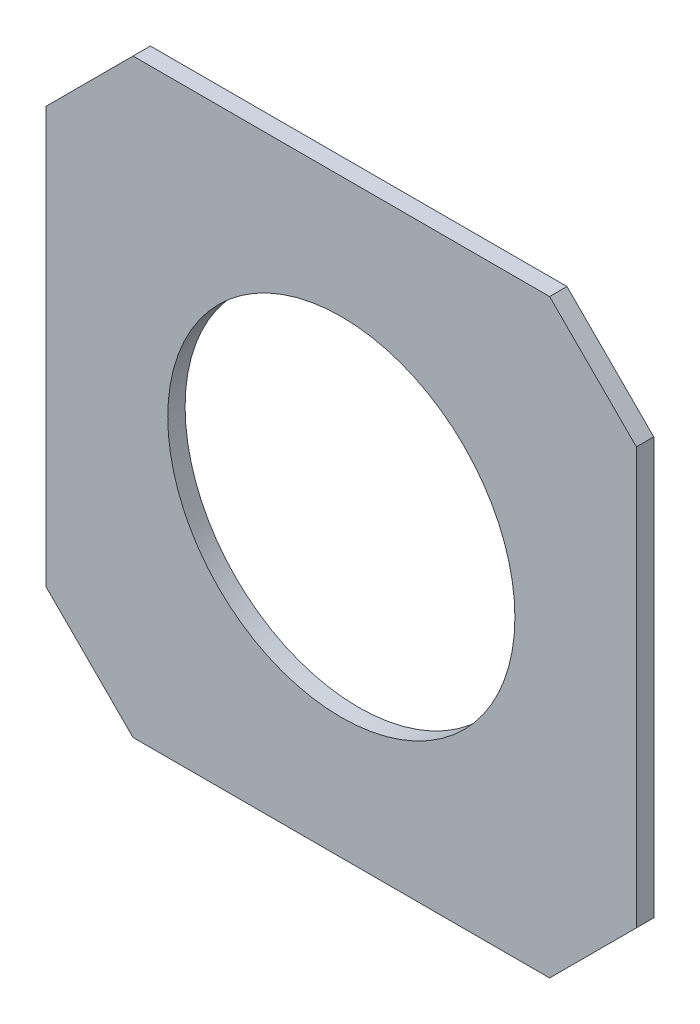
ISO-10303-21;
HEADER;
FILE_DESCRIPTION(('STEP AP214'),'2;1');
FILE_NAME('part.step','',(''),(''),'','','');
FILE_SCHEMA(('AUTOMOTIVE_DESIGN { 1 0 10303 214 1 1 1 1 }'));
ENDSEC;
DATA;
#1=APPLICATION_CONTEXT('core data for automotive mechanical design processes');
#2=APPLICATION_PROTOCOL_DEFINITION('international standard','automotive_design',2000,#1);
#3=PRODUCT_CONTEXT('',#1,'mechanical');
#4=PRODUCT('Part','Part','',(#3));
#5=PRODUCT_RELATED_PRODUCT_CATEGORY('part','',(#4));
#6=PRODUCT_DEFINITION_FORMATION('','',#4);
#7=PRODUCT_DEFINITION_CONTEXT('part definition',#1,'design');
#8=PRODUCT_DEFINITION('design','',#6,#7);
#9=PRODUCT_DEFINITION_SHAPE('','',#8);
#10=(LENGTH_UNIT() NAMED_UNIT(*) SI_UNIT(.MILLI.,.METRE.));
#11=(NAMED_UNIT(*) PLANE_ANGLE_UNIT() SI_UNIT($,.RADIAN.));
#12=(NAMED_UNIT(*) SI_UNIT($,.STERADIAN.) SOLID_ANGLE_UNIT());
#13=UNCERTAINTY_MEASURE_WITH_UNIT(LENGTH_MEASURE(1.E-05),#10,'distance_accuracy_value','');
#14=(GEOMETRIC_REPRESENTATION_CONTEXT(3) GLOBAL_UNCERTAINTY_ASSIGNED_CONTEXT((#13)) GLOBAL_UNIT_ASSIGNED_CONTEXT((#10,
#11,#12)) REPRESENTATION_CONTEXT('',''));
#15=CARTESIAN_POINT('',(0.,0.,0.));
#16=DIRECTION('',(0.,0.,1.));
#17=DIRECTION('',(1.,0.,0.));
#18=AXIS2_PLACEMENT_3D('',#15,#16,#17);
#19=CARTESIAN_POINT('',(17.,0.,0.5));
#20=DIRECTION('',(-1.,0.,0.));
#21=DIRECTION('',(0.,-1.,0.));
#22=AXIS2_PLACEMENT_3D('',#19,#20,#21);
#23=PLANE('',#22);
#24=DIRECTION('',(0.,0.,1.));
#25=VECTOR('',#24,1.);
#26=CARTESIAN_POINT('',(17.,-14.5,0.));
#27=LINE('',#26,#25);
#28=CARTESIAN_POINT('',(17.,-14.5,0.));
#29=VERTEX_POINT('',#28);
#30=CARTESIAN_POINT('',(17.,-14.5,0.5));
#31=VERTEX_POINT('',#30);
#32=EDGE_CURVE('E143',#29,#31,#27,.T.);
#33=ORIENTED_EDGE('',*,*,#32,.F.);
#34=DIRECTION('',(0.,1.,0.));
#35=VECTOR('',#34,1.);
#36=CARTESIAN_POINT('',(17.,0.,0.));
#37=LINE('',#36,#35);
#38=CARTESIAN_POINT('',(17.,-2.5,0.));
#39=VERTEX_POINT('',#38);
#40=EDGE_CURVE('E123',#29,#39,#37,.T.);
#41=ORIENTED_EDGE('',*,*,#40,.T.);
#42=DIRECTION('',(0.,0.,1.));
#43=VECTOR('',#42,1.);
#44=CARTESIAN_POINT('',(17.,-2.5,0.));
#45=LINE('',#44,#43);
#46=CARTESIAN_POINT('',(17.,-2.5,0.5));
#47=VERTEX_POINT('',#46);
#48=EDGE_CURVE('E104',#39,#47,#45,.T.);
#49=ORIENTED_EDGE('',*,*,#48,.T.);
#50=DIRECTION('',(0.,1.,0.));
#51=VECTOR('',#50,1.);
#52=CARTESIAN_POINT('',(17.,0.,0.5));
#53=LINE('',#52,#51);
#54=EDGE_CURVE('E132',#31,#47,#53,.T.);
#55=ORIENTED_EDGE('',*,*,#54,.F.);
#56=EDGE_LOOP('',(#33,#41,#49,#55));
#57=FACE_BOUND('',#56,.T.);
#58=ADVANCED_FACE('F33',(#57),#23,.F.);
#59=CARTESIAN_POINT('',(0.,0.,0.5));
#60=DIRECTION('',(0.,-1.,0.));
#61=DIRECTION('',(0.,0.,-1.));
#62=AXIS2_PLACEMENT_3D('',#59,#60,#61);
#63=PLANE('',#62);
#64=DIRECTION('',(0.,0.,1.));
#65=VECTOR('',#64,1.);
#66=CARTESIAN_POINT('',(2.5,0.,0.));
#67=LINE('',#66,#65);
#68=CARTESIAN_POINT('',(2.5,0.,0.));
#69=VERTEX_POINT('',#68);
#70=CARTESIAN_POINT('',(2.5,0.,0.5));
#71=VERTEX_POINT('',#70);
#72=EDGE_CURVE('E49',#69,#71,#67,.T.);
#73=ORIENTED_EDGE('',*,*,#72,.T.);
#74=DIRECTION('',(-1.,0.,0.));
#75=VECTOR('',#74,1.);
#76=CARTESIAN_POINT('',(0.,0.,0.5));
#77=LINE('',#76,#75);
#78=CARTESIAN_POINT('',(14.5,0.,0.5));
#79=VERTEX_POINT('',#78);
#80=EDGE_CURVE('E117',#79,#71,#77,.T.);
#81=ORIENTED_EDGE('',*,*,#80,.F.);
#82=DIRECTION('',(0.,0.,1.));
#83=VECTOR('',#82,1.);
#84=CARTESIAN_POINT('',(14.5,0.,0.));
#85=LINE('',#84,#83);
#86=CARTESIAN_POINT('',(14.5,0.,0.));
#87=VERTEX_POINT('',#86);
#88=EDGE_CURVE('E101',#87,#79,#85,.T.);
#89=ORIENTED_EDGE('',*,*,#88,.F.);
#90=DIRECTION('',(-1.,0.,0.));
#91=VECTOR('',#90,1.);
#92=CARTESIAN_POINT('',(0.,0.,0.));
#93=LINE('',#92,#91);
#94=EDGE_CURVE('E115',#87,#69,#93,.T.);
#95=ORIENTED_EDGE('',*,*,#94,.T.);
#96=EDGE_LOOP('',(#73,#81,#89,#95));
#97=FACE_BOUND('',#96,.T.);
#98=ADVANCED_FACE('F114',(#97),#63,.F.);
#99=CARTESIAN_POINT('',(0.,-17.,0.5));
#100=DIRECTION('',(1.,0.,0.));
#101=DIRECTION('',(0.,0.,-1.));
#102=AXIS2_PLACEMENT_3D('',#99,#100,#101);
#103=PLANE('',#102);
#104=DIRECTION('',(0.,-1.,0.));
#105=VECTOR('',#104,1.);
#106=CARTESIAN_POINT('',(0.,-17.,0.));
#107=LINE('',#106,#105);
#108=CARTESIAN_POINT('',(0.,-2.5,0.));
#109=VERTEX_POINT('',#108);
#110=CARTESIAN_POINT('',(0.,-14.5,0.));
#111=VERTEX_POINT('',#110);
#112=EDGE_CURVE('E122',#109,#111,#107,.T.);
#113=ORIENTED_EDGE('',*,*,#112,.T.);
#114=DIRECTION('',(0.,0.,1.));
#115=VECTOR('',#114,1.);
#116=CARTESIAN_POINT('',(0.,-14.5,0.));
#117=LINE('',#116,#115);
#118=CARTESIAN_POINT('',(0.,-14.5,0.5));
#119=VERTEX_POINT('',#118);
#120=EDGE_CURVE('E57',#111,#119,#117,.T.);
#121=ORIENTED_EDGE('',*,*,#120,.T.);
#122=DIRECTION('',(0.,-1.,0.));
#123=VECTOR('',#122,1.);
#124=CARTESIAN_POINT('',(0.,-17.,0.5));
#125=LINE('',#124,#123);
#126=CARTESIAN_POINT('',(0.,-2.5,0.5));
#127=VERTEX_POINT('',#126);
#128=EDGE_CURVE('E41',#127,#119,#125,.T.);
#129=ORIENTED_EDGE('',*,*,#128,.F.);
#130=DIRECTION('',(0.,0.,1.));
#131=VECTOR('',#130,1.);
#132=CARTESIAN_POINT('',(0.,-2.5,0.));
#133=LINE('',#132,#131);
#134=EDGE_CURVE('E159',#109,#127,#133,.T.);
#135=ORIENTED_EDGE('',*,*,#134,.F.);
#136=EDGE_LOOP('',(#113,#121,#129,#135));
#137=FACE_BOUND('',#136,.T.);
#138=ADVANCED_FACE('F182',(#137),#103,.F.);
#139=CARTESIAN_POINT('',(17.,-17.,0.5));
#140=DIRECTION('',(0.,1.,0.));
#141=DIRECTION('',(-1.,0.,0.));
#142=AXIS2_PLACEMENT_3D('',#139,#140,#141);
#143=PLANE('',#142);
#144=DIRECTION('',(0.,0.,1.));
#145=VECTOR('',#144,1.);
#146=CARTESIAN_POINT('',(14.5,-17.,0.));
#147=LINE('',#146,#145);
#148=CARTESIAN_POINT('',(14.5,-17.,0.));
#149=VERTEX_POINT('',#148);
#150=CARTESIAN_POINT('',(14.5,-17.,0.5));
#151=VERTEX_POINT('',#150);
#152=EDGE_CURVE('E140',#149,#151,#147,.T.);
#153=ORIENTED_EDGE('',*,*,#152,.T.);
#154=DIRECTION('',(1.,0.,0.));
#155=VECTOR('',#154,1.);
#156=CARTESIAN_POINT('',(17.,-17.,0.5));
#157=LINE('',#156,#155);
#158=CARTESIAN_POINT('',(2.5,-17.,0.5));
#159=VERTEX_POINT('',#158);
#160=EDGE_CURVE('E11',#159,#151,#157,.T.);
#161=ORIENTED_EDGE('',*,*,#160,.F.);
#162=DIRECTION('',(0.,0.,1.));
#163=VECTOR('',#162,1.);
#164=CARTESIAN_POINT('',(2.5,-17.,0.));
#165=LINE('',#164,#163);
#166=CARTESIAN_POINT('',(2.5,-17.,0.));
#167=VERTEX_POINT('',#166);
#168=EDGE_CURVE('E151',#167,#159,#165,.T.);
#169=ORIENTED_EDGE('',*,*,#168,.F.);
#170=DIRECTION('',(1.,0.,0.));
#171=VECTOR('',#170,1.);
#172=CARTESIAN_POINT('',(17.,-17.,0.));
#173=LINE('',#172,#171);
#174=EDGE_CURVE('E36',#167,#149,#173,.T.);
#175=ORIENTED_EDGE('',*,*,#174,.T.);
#176=EDGE_LOOP('',(#153,#161,#169,#175));
#177=FACE_BOUND('',#176,.T.);
#178=ADVANCED_FACE('F177',(#177),#143,.F.);
#179=CARTESIAN_POINT('',(0.,0.,0.5));
#180=DIRECTION('',(0.,0.,-1.));
#181=DIRECTION('',(-1.,0.,0.));
#182=AXIS2_PLACEMENT_3D('',#179,#180,#181);
#183=PLANE('',#182);
#184=CARTESIAN_POINT('',(8.5,-8.5,0.5));
#185=DIRECTION('',(0.,0.,1.));
#186=DIRECTION('',(1.,0.,0.));
#187=AXIS2_PLACEMENT_3D('',#184,#185,#186);
#188=CIRCLE('',#187,5.);
#189=CARTESIAN_POINT('',(13.5,-8.5,0.5));
#190=VERTEX_POINT('',#189);
#191=EDGE_CURVE('E135',#190,#190,#188,.T.);
#192=ORIENTED_EDGE('',*,*,#191,.F.);
#193=EDGE_LOOP('',(#192));
#194=FACE_BOUND('',#193,.T.);
#195=DIRECTION('',(0.707106781186547,0.707106781186549,0.));
#196=VECTOR('',#195,1.);
#197=CARTESIAN_POINT('',(15.75,-15.75,0.5));
#198=LINE('',#197,#196);
#199=EDGE_CURVE('E147',#151,#31,#198,.T.);
#200=ORIENTED_EDGE('',*,*,#199,.T.);
#201=ORIENTED_EDGE('',*,*,#54,.T.);
#202=DIRECTION('',(0.707106781186547,-0.707106781186548,0.));
#203=VECTOR('',#202,1.);
#204=CARTESIAN_POINT('',(7.25,7.25,0.5));
#205=LINE('',#204,#203);
#206=EDGE_CURVE('E109',#79,#47,#205,.T.);
#207=ORIENTED_EDGE('',*,*,#206,.F.);
#208=ORIENTED_EDGE('',*,*,#80,.T.);
#209=DIRECTION('',(-0.707106781186548,-0.707106781186548,0.));
#210=VECTOR('',#209,1.);
#211=CARTESIAN_POINT('',(1.25,-1.25,0.5));
#212=LINE('',#211,#210);
#213=EDGE_CURVE('E155',#71,#127,#212,.T.);
#214=ORIENTED_EDGE('',*,*,#213,.T.);
#215=ORIENTED_EDGE('',*,*,#128,.T.);
#216=DIRECTION('',(-0.707106781186548,0.707106781186548,0.));
#217=VECTOR('',#216,1.);
#218=CARTESIAN_POINT('',(-7.25,-7.25,0.5));
#219=LINE('',#218,#217);
#220=EDGE_CURVE('E146',#159,#119,#219,.T.);
#221=ORIENTED_EDGE('',*,*,#220,.F.);
#222=ORIENTED_EDGE('',*,*,#160,.T.);
#223=EDGE_LOOP('',(#200,#201,#207,#208,#214,#215,#221,#222));
#224=FACE_BOUND('',#223,.T.);
#225=ADVANCED_FACE('F169',(#194,#224),#183,.F.);
#226=CARTESIAN_POINT('',(0.,0.,0.));
#227=DIRECTION('',(0.,0.,-1.));
#228=DIRECTION('',(-1.,0.,0.));
#229=AXIS2_PLACEMENT_3D('',#226,#227,#228);
#230=PLANE('',#229);
#231=CARTESIAN_POINT('',(8.5,-8.5,0.));
#232=DIRECTION('',(0.,0.,1.));
#233=DIRECTION('',(1.,0.,0.));
#234=AXIS2_PLACEMENT_3D('',#231,#232,#233);
#235=CIRCLE('',#234,5.);
#236=CARTESIAN_POINT('',(13.5,-8.5,0.));
#237=VERTEX_POINT('',#236);
#238=EDGE_CURVE('E126',#237,#237,#235,.T.);
#239=ORIENTED_EDGE('',*,*,#238,.T.);
#240=EDGE_LOOP('',(#239));
#241=FACE_BOUND('',#240,.T.);
#242=ORIENTED_EDGE('',*,*,#40,.F.);
#243=DIRECTION('',(0.707106781186547,0.707106781186549,0.));
#244=VECTOR('',#243,1.);
#245=CARTESIAN_POINT('',(15.75,-15.75,0.));
#246=LINE('',#245,#244);
#247=EDGE_CURVE('E144',#149,#29,#246,.T.);
#248=ORIENTED_EDGE('',*,*,#247,.F.);
#249=ORIENTED_EDGE('',*,*,#174,.F.);
#250=DIRECTION('',(-0.707106781186548,0.707106781186548,0.));
#251=VECTOR('',#250,1.);
#252=CARTESIAN_POINT('',(-7.25,-7.25,0.));
#253=LINE('',#252,#251);
#254=EDGE_CURVE('E153',#167,#111,#253,.T.);
#255=ORIENTED_EDGE('',*,*,#254,.T.);
#256=ORIENTED_EDGE('',*,*,#112,.F.);
#257=DIRECTION('',(-0.707106781186548,-0.707106781186548,0.));
#258=VECTOR('',#257,1.);
#259=CARTESIAN_POINT('',(1.25,-1.25,0.));
#260=LINE('',#259,#258);
#261=EDGE_CURVE('E121',#69,#109,#260,.T.);
#262=ORIENTED_EDGE('',*,*,#261,.F.);
#263=ORIENTED_EDGE('',*,*,#94,.F.);
#264=DIRECTION('',(0.707106781186547,-0.707106781186548,0.));
#265=VECTOR('',#264,1.);
#266=CARTESIAN_POINT('',(7.25,7.25,0.));
#267=LINE('',#266,#265);
#268=EDGE_CURVE('E98',#87,#39,#267,.T.);
#269=ORIENTED_EDGE('',*,*,#268,.T.);
#270=EDGE_LOOP('',(#242,#248,#249,#255,#256,#262,#263,#269));
#271=FACE_BOUND('',#270,.T.);
#272=ADVANCED_FACE('F119',(#241,#271),#230,.T.);
#273=CARTESIAN_POINT('',(8.5,-8.5,0.));
#274=DIRECTION('',(0.,0.,1.));
#275=DIRECTION('',(1.,0.,0.));
#276=AXIS2_PLACEMENT_3D('',#273,#274,#275);
#277=CYLINDRICAL_SURFACE('',#276,5.);
#278=ORIENTED_EDGE('',*,*,#238,.F.);
#279=EDGE_LOOP('',(#278));
#280=FACE_BOUND('',#279,.T.);
#281=ORIENTED_EDGE('',*,*,#191,.T.);
#282=EDGE_LOOP('',(#281));
#283=FACE_BOUND('',#282,.T.);
#284=ADVANCED_FACE('F207',(#280,#283),#277,.F.);
#285=CARTESIAN_POINT('',(7.25,7.25,0.));
#286=DIRECTION('',(-0.707106781186548,-0.707106781186547,0.));
#287=DIRECTION('',(0.707106781186547,-0.707106781186548,0.));
#288=AXIS2_PLACEMENT_3D('',#285,#286,#287);
#289=PLANE('',#288);
#290=ORIENTED_EDGE('',*,*,#206,.T.);
#291=ORIENTED_EDGE('',*,*,#48,.F.);
#292=ORIENTED_EDGE('',*,*,#268,.F.);
#293=ORIENTED_EDGE('',*,*,#88,.T.);
#294=EDGE_LOOP('',(#290,#291,#292,#293));
#295=FACE_BOUND('',#294,.T.);
#296=ADVANCED_FACE('F100',(#295),#289,.F.);
#297=CARTESIAN_POINT('',(1.25,-1.25,0.));
#298=DIRECTION('',(-0.707106781186547,0.707106781186547,0.));
#299=DIRECTION('',(-0.707106781186548,-0.707106781186548,0.));
#300=AXIS2_PLACEMENT_3D('',#297,#298,#299);
#301=PLANE('',#300);
#302=ORIENTED_EDGE('',*,*,#213,.F.);
#303=ORIENTED_EDGE('',*,*,#72,.F.);
#304=ORIENTED_EDGE('',*,*,#261,.T.);
#305=ORIENTED_EDGE('',*,*,#134,.T.);
#306=EDGE_LOOP('',(#302,#303,#304,#305));
#307=FACE_BOUND('',#306,.T.);
#308=ADVANCED_FACE('F184',(#307),#301,.T.);
#309=CARTESIAN_POINT('',(-7.25,-7.25,0.));
#310=DIRECTION('',(0.707106781186547,0.707106781186547,0.));
#311=DIRECTION('',(-0.707106781186548,0.707106781186548,0.));
#312=AXIS2_PLACEMENT_3D('',#309,#310,#311);
#313=PLANE('',#312);
#314=ORIENTED_EDGE('',*,*,#220,.T.);
#315=ORIENTED_EDGE('',*,*,#120,.F.);
#316=ORIENTED_EDGE('',*,*,#254,.F.);
#317=ORIENTED_EDGE('',*,*,#168,.T.);
#318=EDGE_LOOP('',(#314,#315,#316,#317));
#319=FACE_BOUND('',#318,.T.);
#320=ADVANCED_FACE('F185',(#319),#313,.F.);
#321=CARTESIAN_POINT('',(15.75,-15.75,0.));
#322=DIRECTION('',(0.707106781186549,-0.707106781186547,0.));
#323=DIRECTION('',(0.707106781186547,0.707106781186549,0.));
#324=AXIS2_PLACEMENT_3D('',#321,#322,#323);
#325=PLANE('',#324);
#326=ORIENTED_EDGE('',*,*,#199,.F.);
#327=ORIENTED_EDGE('',*,*,#152,.F.);
#328=ORIENTED_EDGE('',*,*,#247,.T.);
#329=ORIENTED_EDGE('',*,*,#32,.T.);
#330=EDGE_LOOP('',(#326,#327,#328,#329));
#331=FACE_BOUND('',#330,.T.);
#332=ADVANCED_FACE('F173',(#331),#325,.T.);
#333=CLOSED_SHELL('',(#58,#98,#138,#178,#225,#272,#284,#296,#308,#320,#332));
#334=MANIFOLD_SOLID_BREP('B2',#333);
#335=ADVANCED_BREP_SHAPE_REPRESENTATION('',(#18,#334),#14);
#336=SHAPE_DEFINITION_REPRESENTATION(#9,#335);
ENDSEC;
END-ISO-10303-21;
